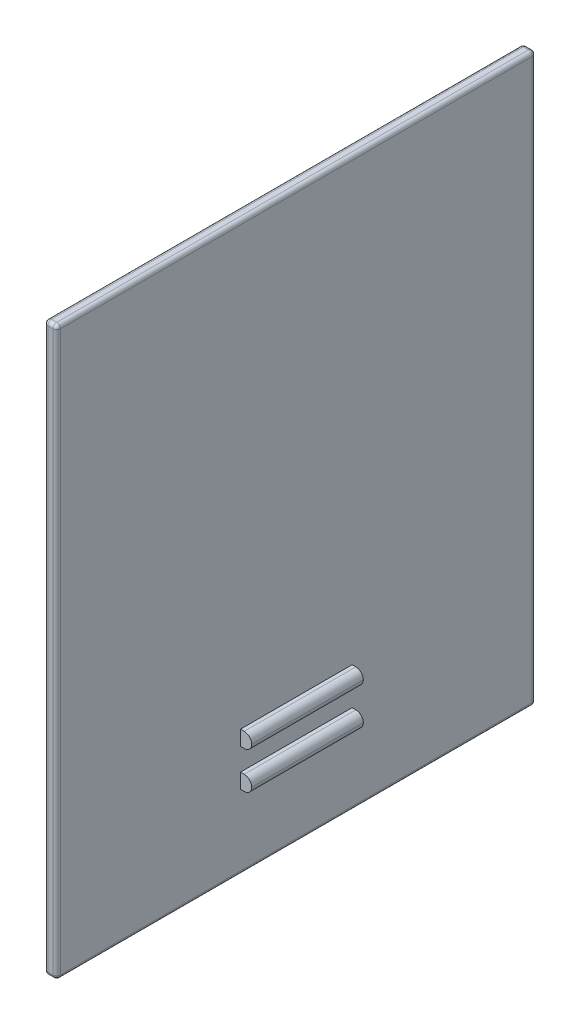
ISO-10303-21;
HEADER;
FILE_DESCRIPTION(('STEP AP214'),'2;1');
FILE_NAME('part.step','',(''),(''),'','','');
FILE_SCHEMA(('AUTOMOTIVE_DESIGN { 1 0 10303 214 1 1 1 1 }'));
ENDSEC;
DATA;
#1=APPLICATION_CONTEXT('core data for automotive mechanical design processes');
#2=APPLICATION_PROTOCOL_DEFINITION('international standard','automotive_design',2000,#1);
#3=PRODUCT_CONTEXT('',#1,'mechanical');
#4=PRODUCT('Part','Part','',(#3));
#5=PRODUCT_RELATED_PRODUCT_CATEGORY('part','',(#4));
#6=PRODUCT_DEFINITION_FORMATION('','',#4);
#7=PRODUCT_DEFINITION_CONTEXT('part definition',#1,'design');
#8=PRODUCT_DEFINITION('design','',#6,#7);
#9=PRODUCT_DEFINITION_SHAPE('','',#8);
#10=(LENGTH_UNIT() NAMED_UNIT(*) SI_UNIT(.MILLI.,.METRE.));
#11=(NAMED_UNIT(*) PLANE_ANGLE_UNIT() SI_UNIT($,.RADIAN.));
#12=(NAMED_UNIT(*) SI_UNIT($,.STERADIAN.) SOLID_ANGLE_UNIT());
#13=UNCERTAINTY_MEASURE_WITH_UNIT(LENGTH_MEASURE(1.E-05),#10,'distance_accuracy_value','');
#14=(GEOMETRIC_REPRESENTATION_CONTEXT(3) GLOBAL_UNCERTAINTY_ASSIGNED_CONTEXT((#13)) GLOBAL_UNIT_ASSIGNED_CONTEXT((#10,
#11,#12)) REPRESENTATION_CONTEXT('',''));
#15=CARTESIAN_POINT('',(0.,0.,0.));
#16=DIRECTION('',(0.,0.,1.));
#17=DIRECTION('',(1.,0.,0.));
#18=AXIS2_PLACEMENT_3D('',#15,#16,#17);
#19=CARTESIAN_POINT('',(25.2,0.,95.));
#20=DIRECTION('',(1.,0.,0.));
#21=DIRECTION('',(0.,0.,1.));
#22=AXIS2_PLACEMENT_3D('',#19,#20,#21);
#23=PLANE('',#22);
#24=DIRECTION('',(0.,1.,0.));
#25=VECTOR('',#24,1.);
#26=CARTESIAN_POINT('',(25.2,38.2,118.2));
#27=LINE('',#26,#25);
#28=CARTESIAN_POINT('',(25.2,-37.5,118.2));
#29=VERTEX_POINT('',#28);
#30=CARTESIAN_POINT('',(25.2,37.7,118.2));
#31=VERTEX_POINT('',#30);
#32=EDGE_CURVE('E338',#29,#31,#27,.T.);
#33=ORIENTED_EDGE('',*,*,#32,.F.);
#34=DIRECTION('',(0.,0.,1.));
#35=VECTOR('',#34,1.);
#36=CARTESIAN_POINT('',(25.2,-37.5,118.7));
#37=LINE('',#36,#35);
#38=CARTESIAN_POINT('',(25.2,-37.5,54.8));
#39=VERTEX_POINT('',#38);
#40=EDGE_CURVE('E335',#39,#29,#37,.T.);
#41=ORIENTED_EDGE('',*,*,#40,.F.);
#42=DIRECTION('',(0.,-1.,0.));
#43=VECTOR('',#42,1.);
#44=CARTESIAN_POINT('',(25.2,-38.,54.8));
#45=LINE('',#44,#43);
#46=CARTESIAN_POINT('',(25.2,37.7,54.8));
#47=VERTEX_POINT('',#46);
#48=EDGE_CURVE('E45',#47,#39,#45,.T.);
#49=ORIENTED_EDGE('',*,*,#48,.F.);
#50=DIRECTION('',(0.,0.,-1.));
#51=VECTOR('',#50,1.);
#52=CARTESIAN_POINT('',(25.2,37.7,54.3));
#53=LINE('',#52,#51);
#54=EDGE_CURVE('E11',#31,#47,#53,.T.);
#55=ORIENTED_EDGE('',*,*,#54,.F.);
#56=EDGE_LOOP('',(#33,#41,#49,#55));
#57=FACE_BOUND('',#56,.T.);
#58=DIRECTION('',(0.,0.,1.));
#59=VECTOR('',#58,1.);
#60=CARTESIAN_POINT('',(25.2,-28.,79.));
#61=LINE('',#60,#59);
#62=CARTESIAN_POINT('',(25.2,-28.,79.));
#63=VERTEX_POINT('',#62);
#64=CARTESIAN_POINT('',(25.2,-28.,94.));
#65=VERTEX_POINT('',#64);
#66=EDGE_CURVE('E229',#63,#65,#61,.T.);
#67=ORIENTED_EDGE('',*,*,#66,.T.);
#68=DIRECTION('',(0.,1.,0.));
#69=VECTOR('',#68,1.);
#70=CARTESIAN_POINT('',(25.2,-26.,94.));
#71=LINE('',#70,#69);
#72=CARTESIAN_POINT('',(25.2,-26.,94.));
#73=VERTEX_POINT('',#72);
#74=EDGE_CURVE('E232',#65,#73,#71,.T.);
#75=ORIENTED_EDGE('',*,*,#74,.T.);
#76=DIRECTION('',(0.,0.,-1.));
#77=VECTOR('',#76,1.);
#78=CARTESIAN_POINT('',(25.2,-26.,79.));
#79=LINE('',#78,#77);
#80=CARTESIAN_POINT('',(25.2,-26.,79.));
#81=VERTEX_POINT('',#80);
#82=EDGE_CURVE('E235',#73,#81,#79,.T.);
#83=ORIENTED_EDGE('',*,*,#82,.T.);
#84=DIRECTION('',(0.,-1.,0.));
#85=VECTOR('',#84,1.);
#86=CARTESIAN_POINT('',(25.2,-26.,79.));
#87=LINE('',#86,#85);
#88=EDGE_CURVE('E203',#81,#63,#87,.T.);
#89=ORIENTED_EDGE('',*,*,#88,.T.);
#90=EDGE_LOOP('',(#67,#75,#83,#89));
#91=FACE_BOUND('',#90,.T.);
#92=DIRECTION('',(0.,0.,1.));
#93=VECTOR('',#92,1.);
#94=CARTESIAN_POINT('',(25.2,-23.,79.));
#95=LINE('',#94,#93);
#96=CARTESIAN_POINT('',(25.2,-23.,79.));
#97=VERTEX_POINT('',#96);
#98=CARTESIAN_POINT('',(25.2,-23.,94.));
#99=VERTEX_POINT('',#98);
#100=EDGE_CURVE('E209',#97,#99,#95,.T.);
#101=ORIENTED_EDGE('',*,*,#100,.T.);
#102=DIRECTION('',(0.,1.,0.));
#103=VECTOR('',#102,1.);
#104=CARTESIAN_POINT('',(25.2,-21.,94.));
#105=LINE('',#104,#103);
#106=CARTESIAN_POINT('',(25.2,-21.,94.));
#107=VERTEX_POINT('',#106);
#108=EDGE_CURVE('E217',#99,#107,#105,.T.);
#109=ORIENTED_EDGE('',*,*,#108,.T.);
#110=DIRECTION('',(0.,0.,-1.));
#111=VECTOR('',#110,1.);
#112=CARTESIAN_POINT('',(25.2,-21.,79.));
#113=LINE('',#112,#111);
#114=CARTESIAN_POINT('',(25.2,-21.,79.));
#115=VERTEX_POINT('',#114);
#116=EDGE_CURVE('E211',#107,#115,#113,.T.);
#117=ORIENTED_EDGE('',*,*,#116,.T.);
#118=DIRECTION('',(0.,-1.,0.));
#119=VECTOR('',#118,1.);
#120=CARTESIAN_POINT('',(25.2,-21.,79.));
#121=LINE('',#120,#119);
#122=EDGE_CURVE('E195',#115,#97,#121,.T.);
#123=ORIENTED_EDGE('',*,*,#122,.T.);
#124=EDGE_LOOP('',(#101,#109,#117,#123));
#125=FACE_BOUND('',#124,.T.);
#126=ADVANCED_FACE('F36',(#57,#91,#125),#23,.T.);
#127=CARTESIAN_POINT('',(25.2,38.2,54.3));
#128=DIRECTION('',(0.,0.,1.));
#129=DIRECTION('',(0.,1.,0.));
#130=AXIS2_PLACEMENT_3D('',#127,#128,#129);
#131=PLANE('',#130);
#132=DIRECTION('',(0.,-1.,0.));
#133=VECTOR('',#132,1.);
#134=CARTESIAN_POINT('',(24.7,38.2,54.3));
#135=LINE('',#134,#133);
#136=CARTESIAN_POINT('',(24.7,-37.5,54.3));
#137=VERTEX_POINT('',#136);
#138=CARTESIAN_POINT('',(24.7,37.7,54.3));
#139=VERTEX_POINT('',#138);
#140=EDGE_CURVE('E280',#137,#139,#135,.F.);
#141=ORIENTED_EDGE('',*,*,#140,.F.);
#142=DIRECTION('',(-1.,0.,0.));
#143=VECTOR('',#142,1.);
#144=CARTESIAN_POINT('',(25.2,-37.5,54.3));
#145=LINE('',#144,#143);
#146=CARTESIAN_POINT('',(24.,-37.5,54.3));
#147=VERTEX_POINT('',#146);
#148=EDGE_CURVE('E274',#147,#137,#145,.F.);
#149=ORIENTED_EDGE('',*,*,#148,.F.);
#150=DIRECTION('',(0.,-1.,0.));
#151=VECTOR('',#150,1.);
#152=CARTESIAN_POINT('',(24.,38.2,54.3));
#153=LINE('',#152,#151);
#154=CARTESIAN_POINT('',(24.,37.7,54.3));
#155=VERTEX_POINT('',#154);
#156=EDGE_CURVE('E282',#155,#147,#153,.T.);
#157=ORIENTED_EDGE('',*,*,#156,.F.);
#158=DIRECTION('',(-1.,0.,0.));
#159=VECTOR('',#158,1.);
#160=CARTESIAN_POINT('',(25.2,37.7,54.3));
#161=LINE('',#160,#159);
#162=EDGE_CURVE('E285',#139,#155,#161,.T.);
#163=ORIENTED_EDGE('',*,*,#162,.F.);
#164=EDGE_LOOP('',(#141,#149,#157,#163));
#165=FACE_BOUND('',#164,.T.);
#166=ADVANCED_FACE('F471',(#165),#131,.F.);
#167=CARTESIAN_POINT('',(25.2,-38.,54.3));
#168=DIRECTION('',(0.,1.,0.));
#169=DIRECTION('',(0.,0.,-1.));
#170=AXIS2_PLACEMENT_3D('',#167,#168,#169);
#171=PLANE('',#170);
#172=DIRECTION('',(-1.,0.,0.));
#173=VECTOR('',#172,1.);
#174=CARTESIAN_POINT('',(25.2,-38.,54.8));
#175=LINE('',#174,#173);
#176=CARTESIAN_POINT('',(24.7,-38.,54.8));
#177=VERTEX_POINT('',#176);
#178=CARTESIAN_POINT('',(24.,-38.,54.8));
#179=VERTEX_POINT('',#178);
#180=EDGE_CURVE('E303',#177,#179,#175,.T.);
#181=ORIENTED_EDGE('',*,*,#180,.F.);
#182=DIRECTION('',(0.,0.,1.));
#183=VECTOR('',#182,1.);
#184=CARTESIAN_POINT('',(24.7,-38.,54.3));
#185=LINE('',#184,#183);
#186=CARTESIAN_POINT('',(24.7,-38.,118.2));
#187=VERTEX_POINT('',#186);
#188=EDGE_CURVE('E300',#187,#177,#185,.F.);
#189=ORIENTED_EDGE('',*,*,#188,.F.);
#190=DIRECTION('',(-1.,0.,0.));
#191=VECTOR('',#190,1.);
#192=CARTESIAN_POINT('',(25.2,-38.,118.2));
#193=LINE('',#192,#191);
#194=CARTESIAN_POINT('',(24.,-38.,118.2));
#195=VERTEX_POINT('',#194);
#196=EDGE_CURVE('E306',#195,#187,#193,.F.);
#197=ORIENTED_EDGE('',*,*,#196,.F.);
#198=DIRECTION('',(0.,0.,1.));
#199=VECTOR('',#198,1.);
#200=CARTESIAN_POINT('',(24.,-38.,54.3));
#201=LINE('',#200,#199);
#202=EDGE_CURVE('E309',#179,#195,#201,.T.);
#203=ORIENTED_EDGE('',*,*,#202,.F.);
#204=EDGE_LOOP('',(#181,#189,#197,#203));
#205=FACE_BOUND('',#204,.T.);
#206=ADVANCED_FACE('F454',(#205),#171,.F.);
#207=CARTESIAN_POINT('',(25.2,38.2,118.7));
#208=DIRECTION('',(0.,0.,-1.));
#209=DIRECTION('',(0.,-1.,0.));
#210=AXIS2_PLACEMENT_3D('',#207,#208,#209);
#211=PLANE('',#210);
#212=DIRECTION('',(0.,1.,0.));
#213=VECTOR('',#212,1.);
#214=CARTESIAN_POINT('',(24.,38.2,118.7));
#215=LINE('',#214,#213);
#216=CARTESIAN_POINT('',(24.,-37.5,118.7));
#217=VERTEX_POINT('',#216);
#218=CARTESIAN_POINT('',(24.,37.7,118.7));
#219=VERTEX_POINT('',#218);
#220=EDGE_CURVE('E318',#217,#219,#215,.T.);
#221=ORIENTED_EDGE('',*,*,#220,.F.);
#222=DIRECTION('',(-1.,0.,0.));
#223=VECTOR('',#222,1.);
#224=CARTESIAN_POINT('',(25.2,-37.5,118.7));
#225=LINE('',#224,#223);
#226=CARTESIAN_POINT('',(24.7,-37.5,118.7));
#227=VERTEX_POINT('',#226);
#228=EDGE_CURVE('E312',#227,#217,#225,.T.);
#229=ORIENTED_EDGE('',*,*,#228,.F.);
#230=DIRECTION('',(0.,1.,0.));
#231=VECTOR('',#230,1.);
#232=CARTESIAN_POINT('',(24.7,-38.,118.7));
#233=LINE('',#232,#231);
#234=CARTESIAN_POINT('',(24.7,37.7,118.7));
#235=VERTEX_POINT('',#234);
#236=EDGE_CURVE('E315',#235,#227,#233,.F.);
#237=ORIENTED_EDGE('',*,*,#236,.F.);
#238=DIRECTION('',(-1.,0.,0.));
#239=VECTOR('',#238,1.);
#240=CARTESIAN_POINT('',(25.2,37.7,118.7));
#241=LINE('',#240,#239);
#242=EDGE_CURVE('E321',#219,#235,#241,.F.);
#243=ORIENTED_EDGE('',*,*,#242,.F.);
#244=EDGE_LOOP('',(#221,#229,#237,#243));
#245=FACE_BOUND('',#244,.T.);
#246=ADVANCED_FACE('F407',(#245),#211,.F.);
#247=CARTESIAN_POINT('',(25.2,38.2,54.3));
#248=DIRECTION('',(0.,-1.,0.));
#249=DIRECTION('',(0.,0.,1.));
#250=AXIS2_PLACEMENT_3D('',#247,#248,#249);
#251=PLANE('',#250);
#252=DIRECTION('',(0.,0.,-1.));
#253=VECTOR('',#252,1.);
#254=CARTESIAN_POINT('',(24.,38.2,54.3));
#255=LINE('',#254,#253);
#256=CARTESIAN_POINT('',(24.,38.2,118.2));
#257=VERTEX_POINT('',#256);
#258=CARTESIAN_POINT('',(24.,38.2,54.8));
#259=VERTEX_POINT('',#258);
#260=EDGE_CURVE('E329',#257,#259,#255,.T.);
#261=ORIENTED_EDGE('',*,*,#260,.F.);
#262=DIRECTION('',(-1.,0.,0.));
#263=VECTOR('',#262,1.);
#264=CARTESIAN_POINT('',(25.2,38.2,118.2));
#265=LINE('',#264,#263);
#266=CARTESIAN_POINT('',(24.7,38.2,118.2));
#267=VERTEX_POINT('',#266);
#268=EDGE_CURVE('E324',#267,#257,#265,.T.);
#269=ORIENTED_EDGE('',*,*,#268,.F.);
#270=DIRECTION('',(0.,0.,-1.));
#271=VECTOR('',#270,1.);
#272=CARTESIAN_POINT('',(24.7,38.2,118.7));
#273=LINE('',#272,#271);
#274=CARTESIAN_POINT('',(24.7,38.2,54.8));
#275=VERTEX_POINT('',#274);
#276=EDGE_CURVE('E327',#275,#267,#273,.F.);
#277=ORIENTED_EDGE('',*,*,#276,.F.);
#278=DIRECTION('',(-1.,0.,0.));
#279=VECTOR('',#278,1.);
#280=CARTESIAN_POINT('',(25.2,38.2,54.8));
#281=LINE('',#280,#279);
#282=EDGE_CURVE('E332',#259,#275,#281,.F.);
#283=ORIENTED_EDGE('',*,*,#282,.F.);
#284=EDGE_LOOP('',(#261,#269,#277,#283));
#285=FACE_BOUND('',#284,.T.);
#286=ADVANCED_FACE('F435',(#285),#251,.F.);
#287=CARTESIAN_POINT('',(23.5,0.,95.));
#288=DIRECTION('',(1.,0.,0.));
#289=DIRECTION('',(0.,0.,1.));
#290=AXIS2_PLACEMENT_3D('',#287,#288,#289);
#291=PLANE('',#290);
#292=DIRECTION('',(0.,0.,1.));
#293=VECTOR('',#292,1.);
#294=CARTESIAN_POINT('',(23.5,-37.5,95.));
#295=LINE('',#294,#293);
#296=CARTESIAN_POINT('',(23.5,-37.5,118.2));
#297=VERTEX_POINT('',#296);
#298=CARTESIAN_POINT('',(23.5,-37.5,54.8));
#299=VERTEX_POINT('',#298);
#300=EDGE_CURVE('E294',#297,#299,#295,.F.);
#301=ORIENTED_EDGE('',*,*,#300,.F.);
#302=DIRECTION('',(0.,1.,0.));
#303=VECTOR('',#302,1.);
#304=CARTESIAN_POINT('',(23.5,0.,118.2));
#305=LINE('',#304,#303);
#306=CARTESIAN_POINT('',(23.5,37.7,118.2));
#307=VERTEX_POINT('',#306);
#308=EDGE_CURVE('E291',#307,#297,#305,.F.);
#309=ORIENTED_EDGE('',*,*,#308,.F.);
#310=DIRECTION('',(0.,0.,-1.));
#311=VECTOR('',#310,1.);
#312=CARTESIAN_POINT('',(23.5,37.7,95.));
#313=LINE('',#312,#311);
#314=CARTESIAN_POINT('',(23.5,37.7,54.8));
#315=VERTEX_POINT('',#314);
#316=EDGE_CURVE('E288',#315,#307,#313,.F.);
#317=ORIENTED_EDGE('',*,*,#316,.F.);
#318=DIRECTION('',(0.,-1.,0.));
#319=VECTOR('',#318,1.);
#320=CARTESIAN_POINT('',(23.5,0.,54.8));
#321=LINE('',#320,#319);
#322=EDGE_CURVE('E297',#299,#315,#321,.F.);
#323=ORIENTED_EDGE('',*,*,#322,.F.);
#324=EDGE_LOOP('',(#301,#309,#317,#323));
#325=FACE_BOUND('',#324,.T.);
#326=ADVANCED_FACE('F482',(#325),#291,.F.);
#327=CARTESIAN_POINT('',(26.7,-26.,79.));
#328=DIRECTION('',(0.,0.,1.));
#329=DIRECTION('',(-1.,0.,0.));
#330=AXIS2_PLACEMENT_3D('',#327,#328,#329);
#331=PLANE('',#330);
#332=CARTESIAN_POINT('',(25.7,-27.,79.));
#333=DIRECTION('',(0.,0.,-1.));
#334=DIRECTION('',(-1.,0.,0.));
#335=AXIS2_PLACEMENT_3D('',#332,#333,#334);
#336=CIRCLE('',#335,1.);
#337=CARTESIAN_POINT('',(25.7,-28.,79.));
#338=VERTEX_POINT('',#337);
#339=CARTESIAN_POINT('',(26.7,-27.,79.));
#340=VERTEX_POINT('',#339);
#341=EDGE_CURVE('E259',#338,#340,#336,.F.);
#342=ORIENTED_EDGE('',*,*,#341,.F.);
#343=DIRECTION('',(-1.,0.,0.));
#344=VECTOR('',#343,1.);
#345=CARTESIAN_POINT('',(26.7,-28.,79.));
#346=LINE('',#345,#344);
#347=EDGE_CURVE('E244',#338,#63,#346,.T.);
#348=ORIENTED_EDGE('',*,*,#347,.T.);
#349=ORIENTED_EDGE('',*,*,#88,.F.);
#350=DIRECTION('',(-1.,0.,0.));
#351=VECTOR('',#350,1.);
#352=CARTESIAN_POINT('',(26.7,-26.,79.));
#353=LINE('',#352,#351);
#354=CARTESIAN_POINT('',(25.7,-26.,79.));
#355=VERTEX_POINT('',#354);
#356=EDGE_CURVE('E238',#355,#81,#353,.T.);
#357=ORIENTED_EDGE('',*,*,#356,.F.);
#358=CARTESIAN_POINT('',(25.7,-27.,79.));
#359=DIRECTION('',(0.,0.,-1.));
#360=DIRECTION('',(-1.,0.,0.));
#361=AXIS2_PLACEMENT_3D('',#358,#359,#360);
#362=CIRCLE('',#361,1.);
#363=EDGE_CURVE('E262',#340,#355,#362,.F.);
#364=ORIENTED_EDGE('',*,*,#363,.F.);
#365=EDGE_LOOP('',(#342,#348,#349,#357,#364));
#366=FACE_BOUND('',#365,.T.);
#367=ADVANCED_FACE('F480',(#366),#331,.F.);
#368=CARTESIAN_POINT('',(26.7,-28.,79.));
#369=DIRECTION('',(0.,1.,0.));
#370=DIRECTION('',(0.,0.,-1.));
#371=AXIS2_PLACEMENT_3D('',#368,#369,#370);
#372=PLANE('',#371);
#373=DIRECTION('',(-1.,0.,0.));
#374=VECTOR('',#373,1.);
#375=CARTESIAN_POINT('',(26.7,-28.,94.));
#376=LINE('',#375,#374);
#377=CARTESIAN_POINT('',(25.7,-28.,94.));
#378=VERTEX_POINT('',#377);
#379=EDGE_CURVE('E242',#378,#65,#376,.T.);
#380=ORIENTED_EDGE('',*,*,#379,.T.);
#381=ORIENTED_EDGE('',*,*,#66,.F.);
#382=ORIENTED_EDGE('',*,*,#347,.F.);
#383=DIRECTION('',(0.,0.,1.));
#384=VECTOR('',#383,1.);
#385=CARTESIAN_POINT('',(25.7,-28.,79.));
#386=LINE('',#385,#384);
#387=EDGE_CURVE('E272',#378,#338,#386,.F.);
#388=ORIENTED_EDGE('',*,*,#387,.F.);
#389=EDGE_LOOP('',(#380,#381,#382,#388));
#390=FACE_BOUND('',#389,.T.);
#391=ADVANCED_FACE('F701',(#390),#372,.F.);
#392=CARTESIAN_POINT('',(26.7,-26.,94.));
#393=DIRECTION('',(0.,0.,-1.));
#394=DIRECTION('',(1.,0.,0.));
#395=AXIS2_PLACEMENT_3D('',#392,#393,#394);
#396=PLANE('',#395);
#397=DIRECTION('',(-1.,0.,0.));
#398=VECTOR('',#397,1.);
#399=CARTESIAN_POINT('',(26.7,-26.,94.));
#400=LINE('',#399,#398);
#401=CARTESIAN_POINT('',(25.7,-26.,94.));
#402=VERTEX_POINT('',#401);
#403=EDGE_CURVE('E240',#402,#73,#400,.T.);
#404=ORIENTED_EDGE('',*,*,#403,.T.);
#405=ORIENTED_EDGE('',*,*,#74,.F.);
#406=ORIENTED_EDGE('',*,*,#379,.F.);
#407=CARTESIAN_POINT('',(25.7,-27.,94.));
#408=DIRECTION('',(0.,0.,1.));
#409=DIRECTION('',(1.,0.,0.));
#410=AXIS2_PLACEMENT_3D('',#407,#408,#409);
#411=CIRCLE('',#410,1.);
#412=CARTESIAN_POINT('',(26.7,-27.,94.));
#413=VERTEX_POINT('',#412);
#414=EDGE_CURVE('E267',#413,#378,#411,.F.);
#415=ORIENTED_EDGE('',*,*,#414,.F.);
#416=CARTESIAN_POINT('',(25.7,-27.,94.));
#417=DIRECTION('',(0.,0.,1.));
#418=DIRECTION('',(1.,0.,0.));
#419=AXIS2_PLACEMENT_3D('',#416,#417,#418);
#420=CIRCLE('',#419,1.);
#421=EDGE_CURVE('E269',#402,#413,#420,.F.);
#422=ORIENTED_EDGE('',*,*,#421,.F.);
#423=EDGE_LOOP('',(#404,#405,#406,#415,#422));
#424=FACE_BOUND('',#423,.T.);
#425=ADVANCED_FACE('F692',(#424),#396,.F.);
#426=CARTESIAN_POINT('',(26.7,-26.,79.));
#427=DIRECTION('',(0.,-1.,0.));
#428=DIRECTION('',(0.,0.,1.));
#429=AXIS2_PLACEMENT_3D('',#426,#427,#428);
#430=PLANE('',#429);
#431=ORIENTED_EDGE('',*,*,#356,.T.);
#432=ORIENTED_EDGE('',*,*,#82,.F.);
#433=ORIENTED_EDGE('',*,*,#403,.F.);
#434=DIRECTION('',(0.,0.,-1.));
#435=VECTOR('',#434,1.);
#436=CARTESIAN_POINT('',(25.7,-26.,94.));
#437=LINE('',#436,#435);
#438=EDGE_CURVE('E265',#355,#402,#437,.F.);
#439=ORIENTED_EDGE('',*,*,#438,.F.);
#440=EDGE_LOOP('',(#431,#432,#433,#439));
#441=FACE_BOUND('',#440,.T.);
#442=ADVANCED_FACE('F684',(#441),#430,.F.);
#443=CARTESIAN_POINT('',(26.7,-21.,79.));
#444=DIRECTION('',(0.,0.,1.));
#445=DIRECTION('',(-1.,0.,0.));
#446=AXIS2_PLACEMENT_3D('',#443,#444,#445);
#447=PLANE('',#446);
#448=CARTESIAN_POINT('',(25.7,-22.,79.));
#449=DIRECTION('',(0.,0.,-1.));
#450=DIRECTION('',(-1.,0.,0.));
#451=AXIS2_PLACEMENT_3D('',#448,#449,#450);
#452=CIRCLE('',#451,1.);
#453=CARTESIAN_POINT('',(25.7,-23.,79.));
#454=VERTEX_POINT('',#453);
#455=CARTESIAN_POINT('',(26.7,-22.,79.));
#456=VERTEX_POINT('',#455);
#457=EDGE_CURVE('E199',#454,#456,#452,.F.);
#458=ORIENTED_EDGE('',*,*,#457,.F.);
#459=DIRECTION('',(-1.,0.,0.));
#460=VECTOR('',#459,1.);
#461=CARTESIAN_POINT('',(26.7,-23.,79.));
#462=LINE('',#461,#460);
#463=EDGE_CURVE('E191',#454,#97,#462,.T.);
#464=ORIENTED_EDGE('',*,*,#463,.T.);
#465=ORIENTED_EDGE('',*,*,#122,.F.);
#466=DIRECTION('',(-1.,0.,0.));
#467=VECTOR('',#466,1.);
#468=CARTESIAN_POINT('',(26.7,-21.,79.));
#469=LINE('',#468,#467);
#470=CARTESIAN_POINT('',(25.7,-21.,79.));
#471=VERTEX_POINT('',#470);
#472=EDGE_CURVE('E222',#471,#115,#469,.T.);
#473=ORIENTED_EDGE('',*,*,#472,.F.);
#474=CARTESIAN_POINT('',(25.7,-22.,79.));
#475=DIRECTION('',(0.,0.,-1.));
#476=DIRECTION('',(-1.,0.,0.));
#477=AXIS2_PLACEMENT_3D('',#474,#475,#476);
#478=CIRCLE('',#477,1.);
#479=EDGE_CURVE('E247',#456,#471,#478,.F.);
#480=ORIENTED_EDGE('',*,*,#479,.F.);
#481=EDGE_LOOP('',(#458,#464,#465,#473,#480));
#482=FACE_BOUND('',#481,.T.);
#483=ADVANCED_FACE('F193',(#482),#447,.F.);
#484=CARTESIAN_POINT('',(26.7,-23.,79.));
#485=DIRECTION('',(0.,1.,0.));
#486=DIRECTION('',(0.,0.,-1.));
#487=AXIS2_PLACEMENT_3D('',#484,#485,#486);
#488=PLANE('',#487);
#489=DIRECTION('',(-1.,0.,0.));
#490=VECTOR('',#489,1.);
#491=CARTESIAN_POINT('',(26.7,-23.,94.));
#492=LINE('',#491,#490);
#493=CARTESIAN_POINT('',(25.7,-23.,94.));
#494=VERTEX_POINT('',#493);
#495=EDGE_CURVE('E204',#494,#99,#492,.T.);
#496=ORIENTED_EDGE('',*,*,#495,.T.);
#497=ORIENTED_EDGE('',*,*,#100,.F.);
#498=ORIENTED_EDGE('',*,*,#463,.F.);
#499=DIRECTION('',(0.,0.,1.));
#500=VECTOR('',#499,1.);
#501=CARTESIAN_POINT('',(25.7,-23.,79.));
#502=LINE('',#501,#500);
#503=EDGE_CURVE('E257',#494,#454,#502,.F.);
#504=ORIENTED_EDGE('',*,*,#503,.F.);
#505=EDGE_LOOP('',(#496,#497,#498,#504));
#506=FACE_BOUND('',#505,.T.);
#507=ADVANCED_FACE('F214',(#506),#488,.F.);
#508=CARTESIAN_POINT('',(26.7,-21.,94.));
#509=DIRECTION('',(0.,0.,-1.));
#510=DIRECTION('',(1.,0.,0.));
#511=AXIS2_PLACEMENT_3D('',#508,#509,#510);
#512=PLANE('',#511);
#513=DIRECTION('',(-1.,0.,0.));
#514=VECTOR('',#513,1.);
#515=CARTESIAN_POINT('',(26.7,-21.,94.));
#516=LINE('',#515,#514);
#517=CARTESIAN_POINT('',(25.7,-21.,94.));
#518=VERTEX_POINT('',#517);
#519=EDGE_CURVE('E224',#518,#107,#516,.T.);
#520=ORIENTED_EDGE('',*,*,#519,.T.);
#521=ORIENTED_EDGE('',*,*,#108,.F.);
#522=ORIENTED_EDGE('',*,*,#495,.F.);
#523=CARTESIAN_POINT('',(25.7,-22.,94.));
#524=DIRECTION('',(0.,0.,1.));
#525=DIRECTION('',(1.,0.,0.));
#526=AXIS2_PLACEMENT_3D('',#523,#524,#525);
#527=CIRCLE('',#526,1.);
#528=CARTESIAN_POINT('',(26.7,-22.,94.));
#529=VERTEX_POINT('',#528);
#530=EDGE_CURVE('E252',#529,#494,#527,.F.);
#531=ORIENTED_EDGE('',*,*,#530,.F.);
#532=CARTESIAN_POINT('',(25.7,-22.,94.));
#533=DIRECTION('',(0.,0.,1.));
#534=DIRECTION('',(1.,0.,0.));
#535=AXIS2_PLACEMENT_3D('',#532,#533,#534);
#536=CIRCLE('',#535,1.);
#537=EDGE_CURVE('E254',#518,#529,#536,.F.);
#538=ORIENTED_EDGE('',*,*,#537,.F.);
#539=EDGE_LOOP('',(#520,#521,#522,#531,#538));
#540=FACE_BOUND('',#539,.T.);
#541=ADVANCED_FACE('F659',(#540),#512,.F.);
#542=CARTESIAN_POINT('',(26.7,-21.,79.));
#543=DIRECTION('',(0.,-1.,0.));
#544=DIRECTION('',(0.,0.,1.));
#545=AXIS2_PLACEMENT_3D('',#542,#543,#544);
#546=PLANE('',#545);
#547=ORIENTED_EDGE('',*,*,#472,.T.);
#548=ORIENTED_EDGE('',*,*,#116,.F.);
#549=ORIENTED_EDGE('',*,*,#519,.F.);
#550=DIRECTION('',(0.,0.,-1.));
#551=VECTOR('',#550,1.);
#552=CARTESIAN_POINT('',(25.7,-21.,94.));
#553=LINE('',#552,#551);
#554=EDGE_CURVE('E250',#471,#518,#553,.F.);
#555=ORIENTED_EDGE('',*,*,#554,.F.);
#556=EDGE_LOOP('',(#547,#548,#549,#555));
#557=FACE_BOUND('',#556,.T.);
#558=ADVANCED_FACE('F500',(#557),#546,.F.);
#559=CARTESIAN_POINT('',(25.7,-22.,95.));
#560=DIRECTION('',(0.,0.,-1.));
#561=DIRECTION('',(1.,0.,0.));
#562=AXIS2_PLACEMENT_3D('',#559,#560,#561);
#563=CYLINDRICAL_SURFACE('',#562,1.);
#564=ORIENTED_EDGE('',*,*,#503,.T.);
#565=ORIENTED_EDGE('',*,*,#457,.T.);
#566=DIRECTION('',(0.,0.,1.));
#567=VECTOR('',#566,1.);
#568=CARTESIAN_POINT('',(26.7,-22.,94.));
#569=LINE('',#568,#567);
#570=EDGE_CURVE('E212',#456,#529,#569,.T.);
#571=ORIENTED_EDGE('',*,*,#570,.T.);
#572=ORIENTED_EDGE('',*,*,#530,.T.);
#573=EDGE_LOOP('',(#564,#565,#571,#572));
#574=FACE_BOUND('',#573,.T.);
#575=ADVANCED_FACE('F496',(#574),#563,.T.);
#576=CARTESIAN_POINT('',(25.7,-22.,95.));
#577=DIRECTION('',(0.,0.,1.));
#578=DIRECTION('',(-1.,0.,0.));
#579=AXIS2_PLACEMENT_3D('',#576,#577,#578);
#580=CYLINDRICAL_SURFACE('',#579,1.);
#581=ORIENTED_EDGE('',*,*,#537,.T.);
#582=ORIENTED_EDGE('',*,*,#570,.F.);
#583=ORIENTED_EDGE('',*,*,#479,.T.);
#584=ORIENTED_EDGE('',*,*,#554,.T.);
#585=EDGE_LOOP('',(#581,#582,#583,#584));
#586=FACE_BOUND('',#585,.T.);
#587=ADVANCED_FACE('F492',(#586),#580,.T.);
#588=CARTESIAN_POINT('',(25.7,-27.,95.));
#589=DIRECTION('',(0.,0.,-1.));
#590=DIRECTION('',(1.,0.,0.));
#591=AXIS2_PLACEMENT_3D('',#588,#589,#590);
#592=CYLINDRICAL_SURFACE('',#591,1.);
#593=ORIENTED_EDGE('',*,*,#387,.T.);
#594=ORIENTED_EDGE('',*,*,#341,.T.);
#595=DIRECTION('',(0.,0.,1.));
#596=VECTOR('',#595,1.);
#597=CARTESIAN_POINT('',(26.7,-27.,94.));
#598=LINE('',#597,#596);
#599=EDGE_CURVE('E276',#340,#413,#598,.T.);
#600=ORIENTED_EDGE('',*,*,#599,.T.);
#601=ORIENTED_EDGE('',*,*,#414,.T.);
#602=EDGE_LOOP('',(#593,#594,#600,#601));
#603=FACE_BOUND('',#602,.T.);
#604=ADVANCED_FACE('F495',(#603),#592,.T.);
#605=CARTESIAN_POINT('',(25.7,-27.,95.));
#606=DIRECTION('',(0.,0.,1.));
#607=DIRECTION('',(-1.,0.,0.));
#608=AXIS2_PLACEMENT_3D('',#605,#606,#607);
#609=CYLINDRICAL_SURFACE('',#608,1.);
#610=ORIENTED_EDGE('',*,*,#421,.T.);
#611=ORIENTED_EDGE('',*,*,#599,.F.);
#612=ORIENTED_EDGE('',*,*,#363,.T.);
#613=ORIENTED_EDGE('',*,*,#438,.T.);
#614=EDGE_LOOP('',(#610,#611,#612,#613));
#615=FACE_BOUND('',#614,.T.);
#616=ADVANCED_FACE('F502',(#615),#609,.T.);
#617=CARTESIAN_POINT('',(24.7,0.,118.2));
#618=DIRECTION('',(0.,-1.,0.));
#619=DIRECTION('',(0.,0.,1.));
#620=AXIS2_PLACEMENT_3D('',#617,#618,#619);
#621=CYLINDRICAL_SURFACE('',#620,0.5);
#622=CARTESIAN_POINT('',(24.7,37.7,118.2));
#623=DIRECTION('',(0.,-1.,0.));
#624=DIRECTION('',(0.,0.,-1.));
#625=AXIS2_PLACEMENT_3D('',#622,#623,#624);
#626=CIRCLE('',#625,0.5);
#627=EDGE_CURVE('E40',#31,#235,#626,.T.);
#628=ORIENTED_EDGE('',*,*,#627,.T.);
#629=ORIENTED_EDGE('',*,*,#236,.T.);
#630=CARTESIAN_POINT('',(24.7,-37.5,118.2));
#631=DIRECTION('',(0.,1.,0.));
#632=DIRECTION('',(1.,0.,0.));
#633=AXIS2_PLACEMENT_3D('',#630,#631,#632);
#634=CIRCLE('',#633,0.5);
#635=EDGE_CURVE('E391',#227,#29,#634,.T.);
#636=ORIENTED_EDGE('',*,*,#635,.T.);
#637=ORIENTED_EDGE('',*,*,#32,.T.);
#638=EDGE_LOOP('',(#628,#629,#636,#637));
#639=FACE_BOUND('',#638,.T.);
#640=ADVANCED_FACE('F38',(#639),#621,.T.);
#641=CARTESIAN_POINT('',(24.7,37.7,118.2));
#642=DIRECTION('',(0.,0.,-1.));
#643=DIRECTION('',(1.,0.,0.));
#644=AXIS2_PLACEMENT_3D('',#641,#642,#643);
#645=SPHERICAL_SURFACE('',#644,0.5);
#646=CARTESIAN_POINT('',(24.7,37.7,118.2));
#647=DIRECTION('',(0.,0.,-1.));
#648=DIRECTION('',(-1.,0.,0.));
#649=AXIS2_PLACEMENT_3D('',#646,#647,#648);
#650=CIRCLE('',#649,0.5);
#651=EDGE_CURVE('E60',#31,#267,#650,.F.);
#652=ORIENTED_EDGE('',*,*,#651,.T.);
#653=CARTESIAN_POINT('',(24.7,37.7,118.2));
#654=DIRECTION('',(-1.,0.,0.));
#655=DIRECTION('',(0.,0.,1.));
#656=AXIS2_PLACEMENT_3D('',#653,#654,#655);
#657=CIRCLE('',#656,0.5);
#658=EDGE_CURVE('E390',#267,#235,#657,.F.);
#659=ORIENTED_EDGE('',*,*,#658,.T.);
#660=ORIENTED_EDGE('',*,*,#627,.F.);
#661=EDGE_LOOP('',(#652,#659,#660));
#662=FACE_BOUND('',#661,.T.);
#663=ADVANCED_FACE('F638',(#662),#645,.T.);
#664=CARTESIAN_POINT('',(24.7,-37.5,118.2));
#665=DIRECTION('',(0.,0.,-1.));
#666=DIRECTION('',(1.,0.,0.));
#667=AXIS2_PLACEMENT_3D('',#664,#665,#666);
#668=SPHERICAL_SURFACE('',#667,0.5);
#669=CARTESIAN_POINT('',(24.7,-37.5,118.2));
#670=DIRECTION('',(-1.,0.,0.));
#671=DIRECTION('',(0.,0.,1.));
#672=AXIS2_PLACEMENT_3D('',#669,#670,#671);
#673=CIRCLE('',#672,0.5);
#674=EDGE_CURVE('E384',#227,#187,#673,.F.);
#675=ORIENTED_EDGE('',*,*,#674,.T.);
#676=CARTESIAN_POINT('',(24.7,-37.5,118.2));
#677=DIRECTION('',(0.,0.,-1.));
#678=DIRECTION('',(-1.,0.,0.));
#679=AXIS2_PLACEMENT_3D('',#676,#677,#678);
#680=CIRCLE('',#679,0.5);
#681=EDGE_CURVE('E387',#187,#29,#680,.F.);
#682=ORIENTED_EDGE('',*,*,#681,.T.);
#683=ORIENTED_EDGE('',*,*,#635,.F.);
#684=EDGE_LOOP('',(#675,#682,#683));
#685=FACE_BOUND('',#684,.T.);
#686=ADVANCED_FACE('F414',(#685),#668,.T.);
#687=CARTESIAN_POINT('',(25.2,37.7,118.2));
#688=DIRECTION('',(-1.,0.,0.));
#689=DIRECTION('',(0.,0.,-1.));
#690=AXIS2_PLACEMENT_3D('',#687,#688,#689);
#691=CYLINDRICAL_SURFACE('',#690,0.5);
#692=ORIENTED_EDGE('',*,*,#658,.F.);
#693=ORIENTED_EDGE('',*,*,#268,.T.);
#694=CARTESIAN_POINT('',(24.,37.7,118.2));
#695=DIRECTION('',(1.,0.,0.));
#696=DIRECTION('',(0.,0.,-1.));
#697=AXIS2_PLACEMENT_3D('',#694,#695,#696);
#698=CIRCLE('',#697,0.5);
#699=EDGE_CURVE('E378',#257,#219,#698,.T.);
#700=ORIENTED_EDGE('',*,*,#699,.T.);
#701=ORIENTED_EDGE('',*,*,#242,.T.);
#702=EDGE_LOOP('',(#692,#693,#700,#701));
#703=FACE_BOUND('',#702,.T.);
#704=ADVANCED_FACE('F403',(#703),#691,.T.);
#705=CARTESIAN_POINT('',(24.7,37.7,95.));
#706=DIRECTION('',(0.,0.,1.));
#707=DIRECTION('',(-1.,0.,0.));
#708=AXIS2_PLACEMENT_3D('',#705,#706,#707);
#709=CYLINDRICAL_SURFACE('',#708,0.5);
#710=ORIENTED_EDGE('',*,*,#651,.F.);
#711=ORIENTED_EDGE('',*,*,#54,.T.);
#712=CARTESIAN_POINT('',(24.7,37.7,54.8));
#713=DIRECTION('',(0.,0.,1.));
#714=DIRECTION('',(1.,0.,0.));
#715=AXIS2_PLACEMENT_3D('',#712,#713,#714);
#716=CIRCLE('',#715,0.5);
#717=EDGE_CURVE('E375',#47,#275,#716,.T.);
#718=ORIENTED_EDGE('',*,*,#717,.T.);
#719=ORIENTED_EDGE('',*,*,#276,.T.);
#720=EDGE_LOOP('',(#710,#711,#718,#719));
#721=FACE_BOUND('',#720,.T.);
#722=ADVANCED_FACE('F424',(#721),#709,.T.);
#723=CARTESIAN_POINT('',(24.7,0.,54.8));
#724=DIRECTION('',(0.,1.,0.));
#725=DIRECTION('',(0.,0.,-1.));
#726=AXIS2_PLACEMENT_3D('',#723,#724,#725);
#727=CYLINDRICAL_SURFACE('',#726,0.5);
#728=CARTESIAN_POINT('',(24.7,-37.5,54.8));
#729=DIRECTION('',(0.,1.,0.));
#730=DIRECTION('',(0.,0.,1.));
#731=AXIS2_PLACEMENT_3D('',#728,#729,#730);
#732=CIRCLE('',#731,0.5);
#733=EDGE_CURVE('E371',#39,#137,#732,.T.);
#734=ORIENTED_EDGE('',*,*,#733,.T.);
#735=ORIENTED_EDGE('',*,*,#140,.T.);
#736=CARTESIAN_POINT('',(24.7,37.7,54.8));
#737=DIRECTION('',(0.,-1.,0.));
#738=DIRECTION('',(0.,0.,-1.));
#739=AXIS2_PLACEMENT_3D('',#736,#737,#738);
#740=CIRCLE('',#739,0.5);
#741=EDGE_CURVE('E53',#139,#47,#740,.T.);
#742=ORIENTED_EDGE('',*,*,#741,.T.);
#743=ORIENTED_EDGE('',*,*,#48,.T.);
#744=EDGE_LOOP('',(#734,#735,#742,#743));
#745=FACE_BOUND('',#744,.T.);
#746=ADVANCED_FACE('F461',(#745),#727,.T.);
#747=CARTESIAN_POINT('',(24.7,-37.5,95.));
#748=DIRECTION('',(0.,0.,-1.));
#749=DIRECTION('',(1.,0.,0.));
#750=AXIS2_PLACEMENT_3D('',#747,#748,#749);
#751=CYLINDRICAL_SURFACE('',#750,0.5);
#752=ORIENTED_EDGE('',*,*,#681,.F.);
#753=ORIENTED_EDGE('',*,*,#188,.T.);
#754=CARTESIAN_POINT('',(24.7,-37.5,54.8));
#755=DIRECTION('',(0.,0.,1.));
#756=DIRECTION('',(1.,0.,0.));
#757=AXIS2_PLACEMENT_3D('',#754,#755,#756);
#758=CIRCLE('',#757,0.5);
#759=EDGE_CURVE('E369',#177,#39,#758,.T.);
#760=ORIENTED_EDGE('',*,*,#759,.T.);
#761=ORIENTED_EDGE('',*,*,#40,.T.);
#762=EDGE_LOOP('',(#752,#753,#760,#761));
#763=FACE_BOUND('',#762,.T.);
#764=ADVANCED_FACE('F416',(#763),#751,.T.);
#765=CARTESIAN_POINT('',(25.2,-37.5,118.2));
#766=DIRECTION('',(-1.,0.,0.));
#767=DIRECTION('',(0.,0.,-1.));
#768=AXIS2_PLACEMENT_3D('',#765,#766,#767);
#769=CYLINDRICAL_SURFACE('',#768,0.5);
#770=ORIENTED_EDGE('',*,*,#674,.F.);
#771=ORIENTED_EDGE('',*,*,#228,.T.);
#772=CARTESIAN_POINT('',(24.,-37.5,118.2));
#773=DIRECTION('',(1.,0.,0.));
#774=DIRECTION('',(0.,0.,-1.));
#775=AXIS2_PLACEMENT_3D('',#772,#773,#774);
#776=CIRCLE('',#775,0.5);
#777=EDGE_CURVE('E366',#217,#195,#776,.T.);
#778=ORIENTED_EDGE('',*,*,#777,.T.);
#779=ORIENTED_EDGE('',*,*,#196,.T.);
#780=EDGE_LOOP('',(#770,#771,#778,#779));
#781=FACE_BOUND('',#780,.T.);
#782=ADVANCED_FACE('F409',(#781),#769,.T.);
#783=CARTESIAN_POINT('',(24.,38.2,118.2));
#784=DIRECTION('',(0.,1.,0.));
#785=DIRECTION('',(0.,0.,-1.));
#786=AXIS2_PLACEMENT_3D('',#783,#784,#785);
#787=CYLINDRICAL_SURFACE('',#786,0.5);
#788=CARTESIAN_POINT('',(24.,37.7,118.2));
#789=DIRECTION('',(0.,-1.,0.));
#790=DIRECTION('',(0.,0.,-1.));
#791=AXIS2_PLACEMENT_3D('',#788,#789,#790);
#792=CIRCLE('',#791,0.5);
#793=EDGE_CURVE('E381',#219,#307,#792,.T.);
#794=ORIENTED_EDGE('',*,*,#793,.T.);
#795=ORIENTED_EDGE('',*,*,#308,.T.);
#796=CARTESIAN_POINT('',(24.,-37.5,118.2));
#797=DIRECTION('',(0.,1.,0.));
#798=DIRECTION('',(0.,0.,1.));
#799=AXIS2_PLACEMENT_3D('',#796,#797,#798);
#800=CIRCLE('',#799,0.5);
#801=EDGE_CURVE('E364',#297,#217,#800,.T.);
#802=ORIENTED_EDGE('',*,*,#801,.T.);
#803=ORIENTED_EDGE('',*,*,#220,.T.);
#804=EDGE_LOOP('',(#794,#795,#802,#803));
#805=FACE_BOUND('',#804,.T.);
#806=ADVANCED_FACE('F443',(#805),#787,.T.);
#807=CARTESIAN_POINT('',(24.,37.7,118.2));
#808=DIRECTION('',(0.,0.,-1.));
#809=DIRECTION('',(1.,0.,0.));
#810=AXIS2_PLACEMENT_3D('',#807,#808,#809);
#811=SPHERICAL_SURFACE('',#810,0.5);
#812=ORIENTED_EDGE('',*,*,#699,.F.);
#813=CARTESIAN_POINT('',(24.,37.7,118.2));
#814=DIRECTION('',(0.,0.,-1.));
#815=DIRECTION('',(-1.,0.,0.));
#816=AXIS2_PLACEMENT_3D('',#813,#814,#815);
#817=CIRCLE('',#816,0.5);
#818=EDGE_CURVE('E362',#257,#307,#817,.F.);
#819=ORIENTED_EDGE('',*,*,#818,.T.);
#820=ORIENTED_EDGE('',*,*,#793,.F.);
#821=EDGE_LOOP('',(#812,#819,#820));
#822=FACE_BOUND('',#821,.T.);
#823=ADVANCED_FACE('F441',(#822),#811,.T.);
#824=CARTESIAN_POINT('',(24.7,37.7,54.8));
#825=DIRECTION('',(0.,0.,-1.));
#826=DIRECTION('',(1.,0.,0.));
#827=AXIS2_PLACEMENT_3D('',#824,#825,#826);
#828=SPHERICAL_SURFACE('',#827,0.5);
#829=ORIENTED_EDGE('',*,*,#741,.F.);
#830=CARTESIAN_POINT('',(24.7,37.7,54.8));
#831=DIRECTION('',(-1.,0.,0.));
#832=DIRECTION('',(0.,0.,1.));
#833=AXIS2_PLACEMENT_3D('',#830,#831,#832);
#834=CIRCLE('',#833,0.5);
#835=EDGE_CURVE('E360',#139,#275,#834,.F.);
#836=ORIENTED_EDGE('',*,*,#835,.T.);
#837=ORIENTED_EDGE('',*,*,#717,.F.);
#838=EDGE_LOOP('',(#829,#836,#837));
#839=FACE_BOUND('',#838,.T.);
#840=ADVANCED_FACE('F533',(#839),#828,.T.);
#841=CARTESIAN_POINT('',(24.7,-37.5,54.8));
#842=DIRECTION('',(0.,0.,-1.));
#843=DIRECTION('',(1.,0.,0.));
#844=AXIS2_PLACEMENT_3D('',#841,#842,#843);
#845=SPHERICAL_SURFACE('',#844,0.5);
#846=ORIENTED_EDGE('',*,*,#759,.F.);
#847=CARTESIAN_POINT('',(24.7,-37.5,54.8));
#848=DIRECTION('',(-1.,0.,0.));
#849=DIRECTION('',(0.,0.,1.));
#850=AXIS2_PLACEMENT_3D('',#847,#848,#849);
#851=CIRCLE('',#850,0.5);
#852=EDGE_CURVE('E358',#177,#137,#851,.F.);
#853=ORIENTED_EDGE('',*,*,#852,.T.);
#854=ORIENTED_EDGE('',*,*,#733,.F.);
#855=EDGE_LOOP('',(#846,#853,#854));
#856=FACE_BOUND('',#855,.T.);
#857=ADVANCED_FACE('F460',(#856),#845,.T.);
#858=CARTESIAN_POINT('',(24.,-37.5,118.2));
#859=DIRECTION('',(0.,0.,-1.));
#860=DIRECTION('',(1.,0.,0.));
#861=AXIS2_PLACEMENT_3D('',#858,#859,#860);
#862=SPHERICAL_SURFACE('',#861,0.5);
#863=ORIENTED_EDGE('',*,*,#801,.F.);
#864=CARTESIAN_POINT('',(24.,-37.5,118.2));
#865=DIRECTION('',(0.,0.,-1.));
#866=DIRECTION('',(-1.,0.,0.));
#867=AXIS2_PLACEMENT_3D('',#864,#865,#866);
#868=CIRCLE('',#867,0.5);
#869=EDGE_CURVE('E356',#297,#195,#868,.F.);
#870=ORIENTED_EDGE('',*,*,#869,.T.);
#871=ORIENTED_EDGE('',*,*,#777,.F.);
#872=EDGE_LOOP('',(#863,#870,#871));
#873=FACE_BOUND('',#872,.T.);
#874=ADVANCED_FACE('F447',(#873),#862,.T.);
#875=CARTESIAN_POINT('',(24.,37.7,54.3));
#876=DIRECTION('',(0.,0.,-1.));
#877=DIRECTION('',(1.,0.,0.));
#878=AXIS2_PLACEMENT_3D('',#875,#876,#877);
#879=CYLINDRICAL_SURFACE('',#878,0.5);
#880=ORIENTED_EDGE('',*,*,#818,.F.);
#881=ORIENTED_EDGE('',*,*,#260,.T.);
#882=CARTESIAN_POINT('',(24.,37.7,54.8));
#883=DIRECTION('',(0.,0.,1.));
#884=DIRECTION('',(1.,0.,0.));
#885=AXIS2_PLACEMENT_3D('',#882,#883,#884);
#886=CIRCLE('',#885,0.5);
#887=EDGE_CURVE('E353',#259,#315,#886,.T.);
#888=ORIENTED_EDGE('',*,*,#887,.T.);
#889=ORIENTED_EDGE('',*,*,#316,.T.);
#890=EDGE_LOOP('',(#880,#881,#888,#889));
#891=FACE_BOUND('',#890,.T.);
#892=ADVANCED_FACE('F437',(#891),#879,.T.);
#893=CARTESIAN_POINT('',(25.2,37.7,54.8));
#894=DIRECTION('',(-1.,0.,0.));
#895=DIRECTION('',(0.,0.,-1.));
#896=AXIS2_PLACEMENT_3D('',#893,#894,#895);
#897=CYLINDRICAL_SURFACE('',#896,0.5);
#898=ORIENTED_EDGE('',*,*,#835,.F.);
#899=ORIENTED_EDGE('',*,*,#162,.T.);
#900=CARTESIAN_POINT('',(24.,37.7,54.8));
#901=DIRECTION('',(1.,0.,0.));
#902=DIRECTION('',(0.,0.,-1.));
#903=AXIS2_PLACEMENT_3D('',#900,#901,#902);
#904=CIRCLE('',#903,0.5);
#905=EDGE_CURVE('E351',#155,#259,#904,.T.);
#906=ORIENTED_EDGE('',*,*,#905,.T.);
#907=ORIENTED_EDGE('',*,*,#282,.T.);
#908=EDGE_LOOP('',(#898,#899,#906,#907));
#909=FACE_BOUND('',#908,.T.);
#910=ADVANCED_FACE('F430',(#909),#897,.T.);
#911=CARTESIAN_POINT('',(25.2,-37.5,54.8));
#912=DIRECTION('',(-1.,0.,0.));
#913=DIRECTION('',(0.,0.,-1.));
#914=AXIS2_PLACEMENT_3D('',#911,#912,#913);
#915=CYLINDRICAL_SURFACE('',#914,0.5);
#916=ORIENTED_EDGE('',*,*,#852,.F.);
#917=ORIENTED_EDGE('',*,*,#180,.T.);
#918=CARTESIAN_POINT('',(24.,-37.5,54.8));
#919=DIRECTION('',(1.,0.,0.));
#920=DIRECTION('',(0.,0.,-1.));
#921=AXIS2_PLACEMENT_3D('',#918,#919,#920);
#922=CIRCLE('',#921,0.5);
#923=EDGE_CURVE('E348',#179,#147,#922,.T.);
#924=ORIENTED_EDGE('',*,*,#923,.T.);
#925=ORIENTED_EDGE('',*,*,#148,.T.);
#926=EDGE_LOOP('',(#916,#917,#924,#925));
#927=FACE_BOUND('',#926,.T.);
#928=ADVANCED_FACE('F456',(#927),#915,.T.);
#929=CARTESIAN_POINT('',(24.,-37.5,54.3));
#930=DIRECTION('',(0.,0.,1.));
#931=DIRECTION('',(-1.,0.,0.));
#932=AXIS2_PLACEMENT_3D('',#929,#930,#931);
#933=CYLINDRICAL_SURFACE('',#932,0.5);
#934=ORIENTED_EDGE('',*,*,#869,.F.);
#935=ORIENTED_EDGE('',*,*,#300,.T.);
#936=CARTESIAN_POINT('',(24.,-37.5,54.8));
#937=DIRECTION('',(0.,0.,1.));
#938=DIRECTION('',(1.,0.,0.));
#939=AXIS2_PLACEMENT_3D('',#936,#937,#938);
#940=CIRCLE('',#939,0.5);
#941=EDGE_CURVE('E346',#299,#179,#940,.T.);
#942=ORIENTED_EDGE('',*,*,#941,.T.);
#943=ORIENTED_EDGE('',*,*,#202,.T.);
#944=EDGE_LOOP('',(#934,#935,#942,#943));
#945=FACE_BOUND('',#944,.T.);
#946=ADVANCED_FACE('F449',(#945),#933,.T.);
#947=CARTESIAN_POINT('',(24.,37.7,54.8));
#948=DIRECTION('',(0.,0.,-1.));
#949=DIRECTION('',(1.,0.,0.));
#950=AXIS2_PLACEMENT_3D('',#947,#948,#949);
#951=SPHERICAL_SURFACE('',#950,0.5);
#952=ORIENTED_EDGE('',*,*,#905,.F.);
#953=CARTESIAN_POINT('',(24.,37.7,54.8));
#954=DIRECTION('',(0.,-1.,0.));
#955=DIRECTION('',(0.,0.,-1.));
#956=AXIS2_PLACEMENT_3D('',#953,#954,#955);
#957=CIRCLE('',#956,0.5);
#958=EDGE_CURVE('E344',#155,#315,#957,.F.);
#959=ORIENTED_EDGE('',*,*,#958,.T.);
#960=ORIENTED_EDGE('',*,*,#887,.F.);
#961=EDGE_LOOP('',(#952,#959,#960));
#962=FACE_BOUND('',#961,.T.);
#963=ADVANCED_FACE('F516',(#962),#951,.T.);
#964=CARTESIAN_POINT('',(24.,-37.5,54.8));
#965=DIRECTION('',(0.,0.,-1.));
#966=DIRECTION('',(1.,0.,0.));
#967=AXIS2_PLACEMENT_3D('',#964,#965,#966);
#968=SPHERICAL_SURFACE('',#967,0.5);
#969=ORIENTED_EDGE('',*,*,#941,.F.);
#970=CARTESIAN_POINT('',(24.,-37.5,54.8));
#971=DIRECTION('',(0.,1.,0.));
#972=DIRECTION('',(0.,0.,1.));
#973=AXIS2_PLACEMENT_3D('',#970,#971,#972);
#974=CIRCLE('',#973,0.5);
#975=EDGE_CURVE('E342',#299,#147,#974,.F.);
#976=ORIENTED_EDGE('',*,*,#975,.T.);
#977=ORIENTED_EDGE('',*,*,#923,.F.);
#978=EDGE_LOOP('',(#969,#976,#977));
#979=FACE_BOUND('',#978,.T.);
#980=ADVANCED_FACE('F512',(#979),#968,.T.);
#981=CARTESIAN_POINT('',(24.,38.2,54.8));
#982=DIRECTION('',(0.,-1.,0.));
#983=DIRECTION('',(0.,0.,1.));
#984=AXIS2_PLACEMENT_3D('',#981,#982,#983);
#985=CYLINDRICAL_SURFACE('',#984,0.5);
#986=ORIENTED_EDGE('',*,*,#958,.F.);
#987=ORIENTED_EDGE('',*,*,#156,.T.);
#988=ORIENTED_EDGE('',*,*,#975,.F.);
#989=ORIENTED_EDGE('',*,*,#322,.T.);
#990=EDGE_LOOP('',(#986,#987,#988,#989));
#991=FACE_BOUND('',#990,.T.);
#992=ADVANCED_FACE('F509',(#991),#985,.T.);
#993=CLOSED_SHELL('',(#126,#166,#206,#246,#286,#326,#367,#391,#425,#442,#483,#507,#541,#558,
#575,#587,#604,#616,#640,#663,#686,#704,#722,#746,#764,#782,#806,#823,#840,#857,#874,#892,#910,
#928,#946,#963,#980,#992));
#994=MANIFOLD_SOLID_BREP('B2',#993);
#995=ADVANCED_BREP_SHAPE_REPRESENTATION('',(#18,#994),#14);
#996=SHAPE_DEFINITION_REPRESENTATION(#9,#995);
ENDSEC;
END-ISO-10303-21;
